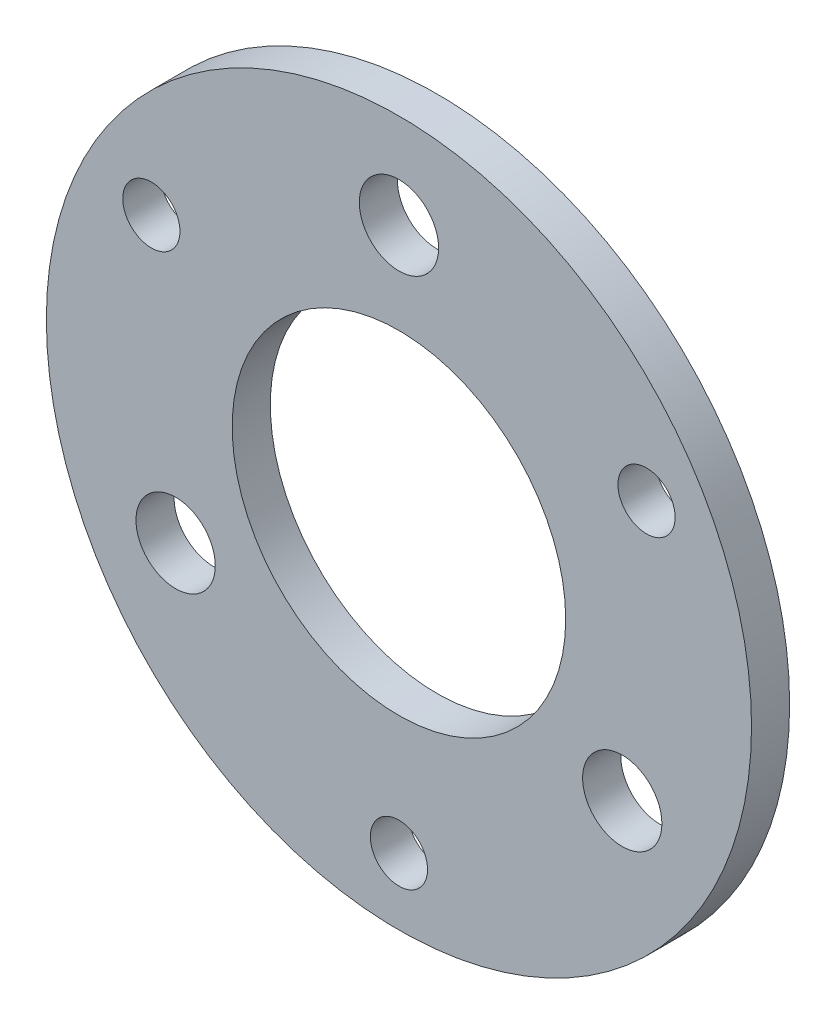
ISO-10303-21;
HEADER;
FILE_DESCRIPTION(('STEP AP214'),'2;1');
FILE_NAME('part.step','',(''),(''),'','','');
FILE_SCHEMA(('AUTOMOTIVE_DESIGN { 1 0 10303 214 1 1 1 1 }'));
ENDSEC;
DATA;
#1=APPLICATION_CONTEXT('core data for automotive mechanical design processes');
#2=APPLICATION_PROTOCOL_DEFINITION('international standard','automotive_design',2000,#1);
#3=PRODUCT_CONTEXT('',#1,'mechanical');
#4=PRODUCT('Part','Part','',(#3));
#5=PRODUCT_RELATED_PRODUCT_CATEGORY('part','',(#4));
#6=PRODUCT_DEFINITION_FORMATION('','',#4);
#7=PRODUCT_DEFINITION_CONTEXT('part definition',#1,'design');
#8=PRODUCT_DEFINITION('design','',#6,#7);
#9=PRODUCT_DEFINITION_SHAPE('','',#8);
#10=(LENGTH_UNIT() NAMED_UNIT(*) SI_UNIT(.MILLI.,.METRE.));
#11=(NAMED_UNIT(*) PLANE_ANGLE_UNIT() SI_UNIT($,.RADIAN.));
#12=(NAMED_UNIT(*) SI_UNIT($,.STERADIAN.) SOLID_ANGLE_UNIT());
#13=UNCERTAINTY_MEASURE_WITH_UNIT(LENGTH_MEASURE(1.E-05),#10,'distance_accuracy_value','');
#14=(GEOMETRIC_REPRESENTATION_CONTEXT(3) GLOBAL_UNCERTAINTY_ASSIGNED_CONTEXT((#13)) GLOBAL_UNIT_ASSIGNED_CONTEXT((#10,
#11,#12)) REPRESENTATION_CONTEXT('',''));
#15=CARTESIAN_POINT('',(0.,0.,0.));
#16=DIRECTION('',(0.,0.,1.));
#17=DIRECTION('',(1.,0.,0.));
#18=AXIS2_PLACEMENT_3D('',#15,#16,#17);
#19=CARTESIAN_POINT('',(1.03217645663689,0.315977942920115,2.));
#20=DIRECTION('',(0.,0.,1.));
#21=DIRECTION('',(1.,0.,0.));
#22=AXIS2_PLACEMENT_3D('',#19,#20,#21);
#23=PLANE('',#22);
#24=CARTESIAN_POINT('',(12.7495001698412,-6.44902205707938,2.));
#25=DIRECTION('',(0.,0.,1.));
#26=DIRECTION('',(1.,0.,0.));
#27=AXIS2_PLACEMENT_3D('',#24,#25,#26);
#28=CIRCLE('',#27,2.08000000000075);
#29=CARTESIAN_POINT('',(14.829500169842,-6.44902205707938,2.));
#30=VERTEX_POINT('',#29);
#31=EDGE_CURVE('E71',#30,#30,#28,.T.);
#32=ORIENTED_EDGE('',*,*,#31,.F.);
#33=EDGE_LOOP('',(#32));
#34=FACE_BOUND('',#33,.T.);
#35=CARTESIAN_POINT('',(14.0225575134035,7.81597794292125,2.));
#36=DIRECTION('',(0.,0.,1.));
#37=DIRECTION('',(1.,0.,0.));
#38=AXIS2_PLACEMENT_3D('',#35,#36,#37);
#39=CIRCLE('',#38,1.5);
#40=CARTESIAN_POINT('',(15.5225575134035,7.81597794292125,2.));
#41=VERTEX_POINT('',#40);
#42=EDGE_CURVE('E59',#41,#41,#39,.T.);
#43=ORIENTED_EDGE('',*,*,#42,.F.);
#44=EDGE_LOOP('',(#43));
#45=FACE_BOUND('',#44,.T.);
#46=CARTESIAN_POINT('',(1.03217645663689,0.315977942920115,2.));
#47=DIRECTION('',(0.,0.,1.));
#48=DIRECTION('',(1.,0.,0.));
#49=AXIS2_PLACEMENT_3D('',#46,#47,#48);
#50=CIRCLE('',#49,8.75);
#51=CARTESIAN_POINT('',(9.78217645663689,0.315977942920115,2.));
#52=VERTEX_POINT('',#51);
#53=EDGE_CURVE('E47',#52,#52,#50,.T.);
#54=ORIENTED_EDGE('',*,*,#53,.F.);
#55=EDGE_LOOP('',(#54));
#56=FACE_BOUND('',#55,.T.);
#57=CARTESIAN_POINT('',(1.03217645663689,0.315977942920115,2.));
#58=DIRECTION('',(0.,0.,1.));
#59=DIRECTION('',(1.,0.,0.));
#60=AXIS2_PLACEMENT_3D('',#57,#58,#59);
#61=CIRCLE('',#60,18.5);
#62=CARTESIAN_POINT('',(19.5321764566369,0.315977942920115,2.));
#63=VERTEX_POINT('',#62);
#64=EDGE_CURVE('E10',#63,#63,#61,.T.);
#65=ORIENTED_EDGE('',*,*,#64,.T.);
#66=EDGE_LOOP('',(#65));
#67=FACE_BOUND('',#66,.T.);
#68=CARTESIAN_POINT('',(1.03217645663689,13.8459779429201,2.));
#69=DIRECTION('',(0.,0.,1.));
#70=DIRECTION('',(1.,0.,0.));
#71=AXIS2_PLACEMENT_3D('',#68,#69,#70);
#72=CIRCLE('',#71,2.08);
#73=CARTESIAN_POINT('',(3.11217645663689,13.8459779429201,2.));
#74=VERTEX_POINT('',#73);
#75=EDGE_CURVE('E42',#74,#74,#72,.T.);
#76=ORIENTED_EDGE('',*,*,#75,.F.);
#77=EDGE_LOOP('',(#76));
#78=FACE_BOUND('',#77,.T.);
#79=CARTESIAN_POINT('',(-11.9582046001297,7.81597794292008,2.));
#80=DIRECTION('',(0.,0.,1.));
#81=DIRECTION('',(1.,0.,0.));
#82=AXIS2_PLACEMENT_3D('',#79,#80,#81);
#83=CIRCLE('',#82,1.5);
#84=CARTESIAN_POINT('',(-10.4582046001297,7.81597794292008,2.));
#85=VERTEX_POINT('',#84);
#86=EDGE_CURVE('E53',#85,#85,#83,.T.);
#87=ORIENTED_EDGE('',*,*,#86,.F.);
#88=EDGE_LOOP('',(#87));
#89=FACE_BOUND('',#88,.T.);
#90=CARTESIAN_POINT('',(1.03217645663789,-14.6840220570793,2.));
#91=DIRECTION('',(0.,0.,1.));
#92=DIRECTION('',(1.,0.,0.));
#93=AXIS2_PLACEMENT_3D('',#90,#91,#92);
#94=CIRCLE('',#93,1.5);
#95=CARTESIAN_POINT('',(2.53217645663789,-14.6840220570793,2.));
#96=VERTEX_POINT('',#95);
#97=EDGE_CURVE('E65',#96,#96,#94,.T.);
#98=ORIENTED_EDGE('',*,*,#97,.F.);
#99=EDGE_LOOP('',(#98));
#100=FACE_BOUND('',#99,.T.);
#101=CARTESIAN_POINT('',(-10.6851472565657,-6.44902205708039,2.));
#102=DIRECTION('',(0.,0.,1.));
#103=DIRECTION('',(1.,0.,0.));
#104=AXIS2_PLACEMENT_3D('',#101,#102,#103);
#105=CIRCLE('',#104,2.08000000000109);
#106=CARTESIAN_POINT('',(-8.60514725656461,-6.44902205708039,2.));
#107=VERTEX_POINT('',#106);
#108=EDGE_CURVE('E77',#107,#107,#105,.T.);
#109=ORIENTED_EDGE('',*,*,#108,.F.);
#110=EDGE_LOOP('',(#109));
#111=FACE_BOUND('',#110,.T.);
#112=ADVANCED_FACE('F31',(#34,#45,#56,#67,#78,#89,#100,#111),#23,.T.);
#113=CARTESIAN_POINT('',(1.03217645663689,0.315977942920115,0.));
#114=DIRECTION('',(0.,0.,1.));
#115=DIRECTION('',(1.,0.,0.));
#116=AXIS2_PLACEMENT_3D('',#113,#114,#115);
#117=PLANE('',#116);
#118=CARTESIAN_POINT('',(1.03217645663689,0.315977942920115,0.));
#119=DIRECTION('',(0.,0.,1.));
#120=DIRECTION('',(1.,0.,0.));
#121=AXIS2_PLACEMENT_3D('',#118,#119,#120);
#122=CIRCLE('',#121,18.5);
#123=CARTESIAN_POINT('',(19.5321764566369,0.315977942920115,0.));
#124=VERTEX_POINT('',#123);
#125=EDGE_CURVE('E35',#124,#124,#122,.T.);
#126=ORIENTED_EDGE('',*,*,#125,.F.);
#127=EDGE_LOOP('',(#126));
#128=FACE_BOUND('',#127,.T.);
#129=CARTESIAN_POINT('',(1.03217645663689,13.8459779429201,0.));
#130=DIRECTION('',(0.,0.,1.));
#131=DIRECTION('',(1.,0.,0.));
#132=AXIS2_PLACEMENT_3D('',#129,#130,#131);
#133=CIRCLE('',#132,2.08);
#134=CARTESIAN_POINT('',(3.11217645663689,13.8459779429201,0.));
#135=VERTEX_POINT('',#134);
#136=EDGE_CURVE('E44',#135,#135,#133,.T.);
#137=ORIENTED_EDGE('',*,*,#136,.T.);
#138=EDGE_LOOP('',(#137));
#139=FACE_BOUND('',#138,.T.);
#140=CARTESIAN_POINT('',(1.03217645663689,0.315977942920115,0.));
#141=DIRECTION('',(0.,0.,1.));
#142=DIRECTION('',(1.,0.,0.));
#143=AXIS2_PLACEMENT_3D('',#140,#141,#142);
#144=CIRCLE('',#143,8.75);
#145=CARTESIAN_POINT('',(9.78217645663689,0.315977942920115,0.));
#146=VERTEX_POINT('',#145);
#147=EDGE_CURVE('E50',#146,#146,#144,.T.);
#148=ORIENTED_EDGE('',*,*,#147,.T.);
#149=EDGE_LOOP('',(#148));
#150=FACE_BOUND('',#149,.T.);
#151=CARTESIAN_POINT('',(-11.9582046001297,7.81597794292008,0.));
#152=DIRECTION('',(0.,0.,1.));
#153=DIRECTION('',(1.,0.,0.));
#154=AXIS2_PLACEMENT_3D('',#151,#152,#153);
#155=CIRCLE('',#154,1.5);
#156=CARTESIAN_POINT('',(-10.4582046001297,7.81597794292008,0.));
#157=VERTEX_POINT('',#156);
#158=EDGE_CURVE('E56',#157,#157,#155,.T.);
#159=ORIENTED_EDGE('',*,*,#158,.T.);
#160=EDGE_LOOP('',(#159));
#161=FACE_BOUND('',#160,.T.);
#162=CARTESIAN_POINT('',(14.0225575134035,7.81597794292125,0.));
#163=DIRECTION('',(0.,0.,1.));
#164=DIRECTION('',(1.,0.,0.));
#165=AXIS2_PLACEMENT_3D('',#162,#163,#164);
#166=CIRCLE('',#165,1.5);
#167=CARTESIAN_POINT('',(15.5225575134035,7.81597794292125,0.));
#168=VERTEX_POINT('',#167);
#169=EDGE_CURVE('E62',#168,#168,#166,.T.);
#170=ORIENTED_EDGE('',*,*,#169,.T.);
#171=EDGE_LOOP('',(#170));
#172=FACE_BOUND('',#171,.T.);
#173=CARTESIAN_POINT('',(1.03217645663789,-14.6840220570793,0.));
#174=DIRECTION('',(0.,0.,1.));
#175=DIRECTION('',(1.,0.,0.));
#176=AXIS2_PLACEMENT_3D('',#173,#174,#175);
#177=CIRCLE('',#176,1.5);
#178=CARTESIAN_POINT('',(2.53217645663789,-14.6840220570793,0.));
#179=VERTEX_POINT('',#178);
#180=EDGE_CURVE('E68',#179,#179,#177,.T.);
#181=ORIENTED_EDGE('',*,*,#180,.T.);
#182=EDGE_LOOP('',(#181));
#183=FACE_BOUND('',#182,.T.);
#184=CARTESIAN_POINT('',(12.7495001698412,-6.44902205707938,0.));
#185=DIRECTION('',(0.,0.,1.));
#186=DIRECTION('',(1.,0.,0.));
#187=AXIS2_PLACEMENT_3D('',#184,#185,#186);
#188=CIRCLE('',#187,2.08000000000075);
#189=CARTESIAN_POINT('',(14.829500169842,-6.44902205707938,0.));
#190=VERTEX_POINT('',#189);
#191=EDGE_CURVE('E74',#190,#190,#188,.T.);
#192=ORIENTED_EDGE('',*,*,#191,.T.);
#193=EDGE_LOOP('',(#192));
#194=FACE_BOUND('',#193,.T.);
#195=CARTESIAN_POINT('',(-10.6851472565657,-6.44902205708039,0.));
#196=DIRECTION('',(0.,0.,1.));
#197=DIRECTION('',(1.,0.,0.));
#198=AXIS2_PLACEMENT_3D('',#195,#196,#197);
#199=CIRCLE('',#198,2.08000000000109);
#200=CARTESIAN_POINT('',(-8.60514725656461,-6.44902205708039,0.));
#201=VERTEX_POINT('',#200);
#202=EDGE_CURVE('E80',#201,#201,#199,.T.);
#203=ORIENTED_EDGE('',*,*,#202,.T.);
#204=EDGE_LOOP('',(#203));
#205=FACE_BOUND('',#204,.T.);
#206=ADVANCED_FACE('F90',(#128,#139,#150,#161,#172,#183,#194,#205),#117,.F.);
#207=CARTESIAN_POINT('',(1.03217645663689,0.315977942920115,2.));
#208=DIRECTION('',(0.,0.,-1.));
#209=DIRECTION('',(-1.,0.,0.));
#210=AXIS2_PLACEMENT_3D('',#207,#208,#209);
#211=CYLINDRICAL_SURFACE('',#210,18.5);
#212=ORIENTED_EDGE('',*,*,#64,.F.);
#213=EDGE_LOOP('',(#212));
#214=FACE_BOUND('',#213,.T.);
#215=ORIENTED_EDGE('',*,*,#125,.T.);
#216=EDGE_LOOP('',(#215));
#217=FACE_BOUND('',#216,.T.);
#218=ADVANCED_FACE('F33',(#214,#217),#211,.T.);
#219=CARTESIAN_POINT('',(1.03217645663689,13.8459779429201,2.));
#220=DIRECTION('',(0.,0.,-1.));
#221=DIRECTION('',(-1.,0.,0.));
#222=AXIS2_PLACEMENT_3D('',#219,#220,#221);
#223=CYLINDRICAL_SURFACE('',#222,2.08);
#224=ORIENTED_EDGE('',*,*,#75,.T.);
#225=EDGE_LOOP('',(#224));
#226=FACE_BOUND('',#225,.T.);
#227=ORIENTED_EDGE('',*,*,#136,.F.);
#228=EDGE_LOOP('',(#227));
#229=FACE_BOUND('',#228,.T.);
#230=ADVANCED_FACE('F100',(#226,#229),#223,.F.);
#231=CARTESIAN_POINT('',(1.03217645663689,0.315977942920115,2.));
#232=DIRECTION('',(0.,0.,-1.));
#233=DIRECTION('',(-1.,0.,0.));
#234=AXIS2_PLACEMENT_3D('',#231,#232,#233);
#235=CYLINDRICAL_SURFACE('',#234,8.75);
#236=ORIENTED_EDGE('',*,*,#53,.T.);
#237=EDGE_LOOP('',(#236));
#238=FACE_BOUND('',#237,.T.);
#239=ORIENTED_EDGE('',*,*,#147,.F.);
#240=EDGE_LOOP('',(#239));
#241=FACE_BOUND('',#240,.T.);
#242=ADVANCED_FACE('F103',(#238,#241),#235,.F.);
#243=CARTESIAN_POINT('',(-11.9582046001297,7.81597794292008,2.));
#244=DIRECTION('',(0.,0.,-1.));
#245=DIRECTION('',(-1.,0.,0.));
#246=AXIS2_PLACEMENT_3D('',#243,#244,#245);
#247=CYLINDRICAL_SURFACE('',#246,1.5);
#248=ORIENTED_EDGE('',*,*,#86,.T.);
#249=EDGE_LOOP('',(#248));
#250=FACE_BOUND('',#249,.T.);
#251=ORIENTED_EDGE('',*,*,#158,.F.);
#252=EDGE_LOOP('',(#251));
#253=FACE_BOUND('',#252,.T.);
#254=ADVANCED_FACE('F107',(#250,#253),#247,.F.);
#255=CARTESIAN_POINT('',(14.0225575134035,7.81597794292125,2.));
#256=DIRECTION('',(0.,0.,-1.));
#257=DIRECTION('',(-1.,0.,0.));
#258=AXIS2_PLACEMENT_3D('',#255,#256,#257);
#259=CYLINDRICAL_SURFACE('',#258,1.5);
#260=ORIENTED_EDGE('',*,*,#42,.T.);
#261=EDGE_LOOP('',(#260));
#262=FACE_BOUND('',#261,.T.);
#263=ORIENTED_EDGE('',*,*,#169,.F.);
#264=EDGE_LOOP('',(#263));
#265=FACE_BOUND('',#264,.T.);
#266=ADVANCED_FACE('F111',(#262,#265),#259,.F.);
#267=CARTESIAN_POINT('',(1.03217645663789,-14.6840220570793,2.));
#268=DIRECTION('',(0.,0.,-1.));
#269=DIRECTION('',(-1.,0.,0.));
#270=AXIS2_PLACEMENT_3D('',#267,#268,#269);
#271=CYLINDRICAL_SURFACE('',#270,1.5);
#272=ORIENTED_EDGE('',*,*,#97,.T.);
#273=EDGE_LOOP('',(#272));
#274=FACE_BOUND('',#273,.T.);
#275=ORIENTED_EDGE('',*,*,#180,.F.);
#276=EDGE_LOOP('',(#275));
#277=FACE_BOUND('',#276,.T.);
#278=ADVANCED_FACE('F115',(#274,#277),#271,.F.);
#279=CARTESIAN_POINT('',(12.7495001698412,-6.44902205707938,2.));
#280=DIRECTION('',(0.,0.,-1.));
#281=DIRECTION('',(-1.,0.,0.));
#282=AXIS2_PLACEMENT_3D('',#279,#280,#281);
#283=CYLINDRICAL_SURFACE('',#282,2.08000000000075);
#284=ORIENTED_EDGE('',*,*,#31,.T.);
#285=EDGE_LOOP('',(#284));
#286=FACE_BOUND('',#285,.T.);
#287=ORIENTED_EDGE('',*,*,#191,.F.);
#288=EDGE_LOOP('',(#287));
#289=FACE_BOUND('',#288,.T.);
#290=ADVANCED_FACE('F119',(#286,#289),#283,.F.);
#291=CARTESIAN_POINT('',(-10.6851472565657,-6.44902205708039,2.));
#292=DIRECTION('',(0.,0.,-1.));
#293=DIRECTION('',(-1.,0.,0.));
#294=AXIS2_PLACEMENT_3D('',#291,#292,#293);
#295=CYLINDRICAL_SURFACE('',#294,2.08000000000109);
#296=ORIENTED_EDGE('',*,*,#108,.T.);
#297=EDGE_LOOP('',(#296));
#298=FACE_BOUND('',#297,.T.);
#299=ORIENTED_EDGE('',*,*,#202,.F.);
#300=EDGE_LOOP('',(#299));
#301=FACE_BOUND('',#300,.T.);
#302=ADVANCED_FACE('F86',(#298,#301),#295,.F.);
#303=CLOSED_SHELL('',(#112,#206,#218,#230,#242,#254,#266,#278,#290,#302));
#304=MANIFOLD_SOLID_BREP('B2',#303);
#305=ADVANCED_BREP_SHAPE_REPRESENTATION('',(#18,#304),#14);
#306=SHAPE_DEFINITION_REPRESENTATION(#9,#305);
ENDSEC;
END-ISO-10303-21;
